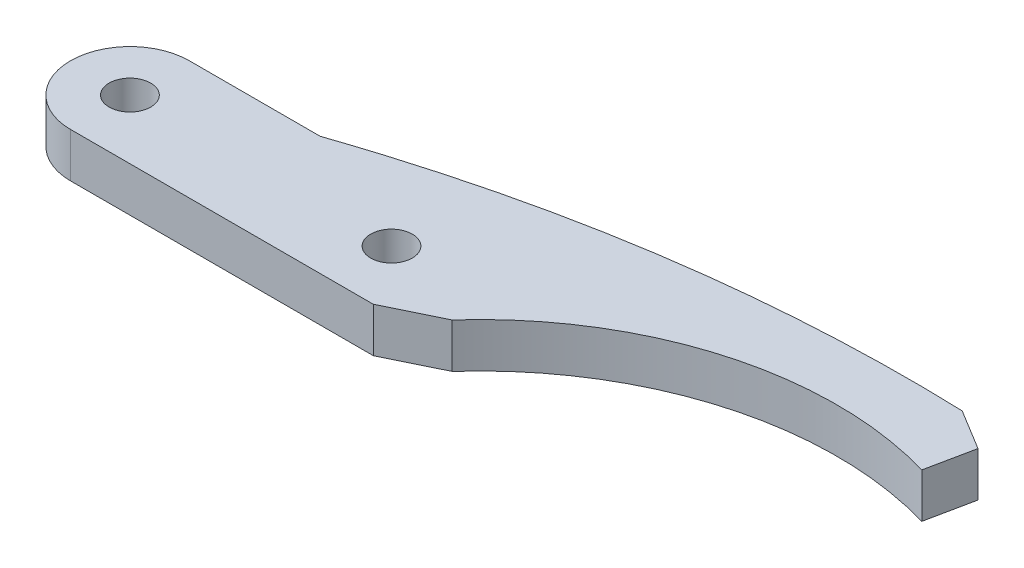
ISO-10303-21;
HEADER;
FILE_DESCRIPTION(('STEP AP214'),'2;1');
FILE_NAME('part.step','',(''),(''),'','','');
FILE_SCHEMA(('AUTOMOTIVE_DESIGN { 1 0 10303 214 1 1 1 1 }'));
ENDSEC;
DATA;
#1=APPLICATION_CONTEXT('core data for automotive mechanical design processes');
#2=APPLICATION_PROTOCOL_DEFINITION('international standard','automotive_design',2000,#1);
#3=PRODUCT_CONTEXT('',#1,'mechanical');
#4=PRODUCT('Part','Part','',(#3));
#5=PRODUCT_RELATED_PRODUCT_CATEGORY('part','',(#4));
#6=PRODUCT_DEFINITION_FORMATION('','',#4);
#7=PRODUCT_DEFINITION_CONTEXT('part definition',#1,'design');
#8=PRODUCT_DEFINITION('design','',#6,#7);
#9=PRODUCT_DEFINITION_SHAPE('','',#8);
#10=(LENGTH_UNIT() NAMED_UNIT(*) SI_UNIT(.MILLI.,.METRE.));
#11=(NAMED_UNIT(*) PLANE_ANGLE_UNIT() SI_UNIT($,.RADIAN.));
#12=(NAMED_UNIT(*) SI_UNIT($,.STERADIAN.) SOLID_ANGLE_UNIT());
#13=UNCERTAINTY_MEASURE_WITH_UNIT(LENGTH_MEASURE(1.E-05),#10,'distance_accuracy_value','');
#14=(GEOMETRIC_REPRESENTATION_CONTEXT(3) GLOBAL_UNCERTAINTY_ASSIGNED_CONTEXT((#13)) GLOBAL_UNIT_ASSIGNED_CONTEXT((#10,
#11,#12)) REPRESENTATION_CONTEXT('',''));
#15=CARTESIAN_POINT('',(0.,0.,0.));
#16=DIRECTION('',(0.,0.,1.));
#17=DIRECTION('',(1.,0.,0.));
#18=AXIS2_PLACEMENT_3D('',#15,#16,#17);
#19=CARTESIAN_POINT('',(0.,10.,0.));
#20=DIRECTION('',(0.,-1.,0.));
#21=DIRECTION('',(0.,0.,-1.));
#22=AXIS2_PLACEMENT_3D('',#19,#20,#21);
#23=CYLINDRICAL_SURFACE('',#22,20.);
#24=CARTESIAN_POINT('',(0.,15.,0.));
#25=DIRECTION('',(0.,1.,0.));
#26=DIRECTION('',(0.,0.,1.));
#27=AXIS2_PLACEMENT_3D('',#24,#25,#26);
#28=CIRCLE('',#27,20.);
#29=CARTESIAN_POINT('',(0.,15.,-20.));
#30=VERTEX_POINT('',#29);
#31=CARTESIAN_POINT('',(0.,15.,20.));
#32=VERTEX_POINT('',#31);
#33=EDGE_CURVE('E181',#30,#32,#28,.T.);
#34=ORIENTED_EDGE('',*,*,#33,.F.);
#35=DIRECTION('',(0.,-1.,0.));
#36=VECTOR('',#35,1.);
#37=CARTESIAN_POINT('',(0.,10.,-20.));
#38=LINE('',#37,#36);
#39=CARTESIAN_POINT('',(0.,0.,-20.));
#40=VERTEX_POINT('',#39);
#41=EDGE_CURVE('E53',#30,#40,#38,.T.);
#42=ORIENTED_EDGE('',*,*,#41,.T.);
#43=CARTESIAN_POINT('',(0.,0.,0.));
#44=DIRECTION('',(0.,1.,0.));
#45=DIRECTION('',(0.,0.,1.));
#46=AXIS2_PLACEMENT_3D('',#43,#44,#45);
#47=CIRCLE('',#46,20.);
#48=CARTESIAN_POINT('',(0.,0.,20.));
#49=VERTEX_POINT('',#48);
#50=EDGE_CURVE('E159',#40,#49,#47,.T.);
#51=ORIENTED_EDGE('',*,*,#50,.T.);
#52=DIRECTION('',(0.,-1.,0.));
#53=VECTOR('',#52,1.);
#54=CARTESIAN_POINT('',(0.,10.,20.));
#55=LINE('',#54,#53);
#56=EDGE_CURVE('E11',#32,#49,#55,.T.);
#57=ORIENTED_EDGE('',*,*,#56,.F.);
#58=EDGE_LOOP('',(#34,#42,#51,#57));
#59=FACE_BOUND('',#58,.T.);
#60=ADVANCED_FACE('F44',(#59),#23,.T.);
#61=CARTESIAN_POINT('',(0.,10.,20.));
#62=DIRECTION('',(0.,0.,1.));
#63=DIRECTION('',(1.,0.,0.));
#64=AXIS2_PLACEMENT_3D('',#61,#62,#63);
#65=PLANE('',#64);
#66=DIRECTION('',(0.,1.,0.));
#67=VECTOR('',#66,1.);
#68=CARTESIAN_POINT('',(101.910822615066,0.,20.));
#69=LINE('',#68,#67);
#70=CARTESIAN_POINT('',(101.910822615066,0.,20.));
#71=VERTEX_POINT('',#70);
#72=CARTESIAN_POINT('',(101.910822615066,15.,20.));
#73=VERTEX_POINT('',#72);
#74=EDGE_CURVE('E147',#71,#73,#69,.T.);
#75=ORIENTED_EDGE('',*,*,#74,.T.);
#76=DIRECTION('',(1.,0.,0.));
#77=VECTOR('',#76,1.);
#78=CARTESIAN_POINT('',(0.,15.,20.));
#79=LINE('',#78,#77);
#80=EDGE_CURVE('E198',#32,#73,#79,.T.);
#81=ORIENTED_EDGE('',*,*,#80,.F.);
#82=ORIENTED_EDGE('',*,*,#56,.T.);
#83=DIRECTION('',(-1.,0.,0.));
#84=VECTOR('',#83,1.);
#85=CARTESIAN_POINT('',(0.,0.,20.));
#86=LINE('',#85,#84);
#87=EDGE_CURVE('E164',#71,#49,#86,.T.);
#88=ORIENTED_EDGE('',*,*,#87,.F.);
#89=EDGE_LOOP('',(#75,#81,#82,#88));
#90=FACE_BOUND('',#89,.T.);
#91=ADVANCED_FACE('F193',(#90),#65,.T.);
#92=CARTESIAN_POINT('',(0.,10.,-20.));
#93=DIRECTION('',(0.,0.,1.));
#94=DIRECTION('',(1.,0.,0.));
#95=AXIS2_PLACEMENT_3D('',#92,#93,#94);
#96=PLANE('',#95);
#97=DIRECTION('',(-1.,0.,-4.42066680035251E-11));
#98=VECTOR('',#97,1.);
#99=CARTESIAN_POINT('',(43.9999999944218,15.,-19.9999999980549));
#100=LINE('',#99,#98);
#101=CARTESIAN_POINT('',(43.999999991625,15.,-19.9999999971214));
#102=VERTEX_POINT('',#101);
#103=EDGE_CURVE('E265',#102,#30,#100,.T.);
#104=ORIENTED_EDGE('',*,*,#103,.F.);
#105=DIRECTION('',(0.,-1.,0.));
#106=VECTOR('',#105,1.);
#107=CARTESIAN_POINT('',(43.9999999972152,20.,-19.9999999990204));
#108=LINE('',#107,#106);
#109=CARTESIAN_POINT('',(44.,10.,-20.));
#110=VERTEX_POINT('',#109);
#111=EDGE_CURVE('E68',#102,#110,#108,.T.);
#112=ORIENTED_EDGE('',*,*,#111,.T.);
#113=DIRECTION('',(0.,1.,0.));
#114=VECTOR('',#113,1.);
#115=CARTESIAN_POINT('',(44.,0.,-20.));
#116=LINE('',#115,#114);
#117=CARTESIAN_POINT('',(44.,0.,-20.));
#118=VERTEX_POINT('',#117);
#119=EDGE_CURVE('E160',#118,#110,#116,.T.);
#120=ORIENTED_EDGE('',*,*,#119,.F.);
#121=DIRECTION('',(-1.,0.,0.));
#122=VECTOR('',#121,1.);
#123=CARTESIAN_POINT('',(0.,0.,-20.));
#124=LINE('',#123,#122);
#125=EDGE_CURVE('E168',#118,#40,#124,.T.);
#126=ORIENTED_EDGE('',*,*,#125,.T.);
#127=ORIENTED_EDGE('',*,*,#41,.F.);
#128=EDGE_LOOP('',(#104,#112,#120,#126,#127));
#129=FACE_BOUND('',#128,.T.);
#130=ADVANCED_FACE('F182',(#129),#96,.F.);
#131=CARTESIAN_POINT('',(0.,10.,0.));
#132=DIRECTION('',(0.,-1.,0.));
#133=DIRECTION('',(0.,0.,-1.));
#134=AXIS2_PLACEMENT_3D('',#131,#132,#133);
#135=CYLINDRICAL_SURFACE('',#134,7.);
#136=CARTESIAN_POINT('',(0.,0.,0.));
#137=DIRECTION('',(0.,1.,0.));
#138=DIRECTION('',(0.,0.,1.));
#139=AXIS2_PLACEMENT_3D('',#136,#137,#138);
#140=CIRCLE('',#139,7.);
#141=CARTESIAN_POINT('',(0.,0.,7.));
#142=VERTEX_POINT('',#141);
#143=EDGE_CURVE('E155',#142,#142,#140,.T.);
#144=ORIENTED_EDGE('',*,*,#143,.F.);
#145=EDGE_LOOP('',(#144));
#146=FACE_BOUND('',#145,.T.);
#147=CARTESIAN_POINT('',(0.,15.,0.));
#148=DIRECTION('',(0.,1.,0.));
#149=DIRECTION('',(0.,0.,1.));
#150=AXIS2_PLACEMENT_3D('',#147,#148,#149);
#151=CIRCLE('',#150,7.);
#152=CARTESIAN_POINT('',(0.,15.,7.));
#153=VERTEX_POINT('',#152);
#154=EDGE_CURVE('E125',#153,#153,#151,.T.);
#155=ORIENTED_EDGE('',*,*,#154,.T.);
#156=EDGE_LOOP('',(#155));
#157=FACE_BOUND('',#156,.T.);
#158=ADVANCED_FACE('F46',(#146,#157),#135,.F.);
#159=CARTESIAN_POINT('',(88.,10.,0.));
#160=DIRECTION('',(0.,-1.,0.));
#161=DIRECTION('',(0.,0.,-1.));
#162=AXIS2_PLACEMENT_3D('',#159,#160,#161);
#163=CYLINDRICAL_SURFACE('',#162,7.);
#164=CARTESIAN_POINT('',(88.,0.,0.));
#165=DIRECTION('',(0.,1.,0.));
#166=DIRECTION('',(0.,0.,1.));
#167=AXIS2_PLACEMENT_3D('',#164,#165,#166);
#168=CIRCLE('',#167,7.);
#169=CARTESIAN_POINT('',(88.,0.,7.));
#170=VERTEX_POINT('',#169);
#171=EDGE_CURVE('E172',#170,#170,#168,.T.);
#172=ORIENTED_EDGE('',*,*,#171,.F.);
#173=EDGE_LOOP('',(#172));
#174=FACE_BOUND('',#173,.T.);
#175=CARTESIAN_POINT('',(88.,15.,0.));
#176=DIRECTION('',(0.,1.,0.));
#177=DIRECTION('',(0.,0.,1.));
#178=AXIS2_PLACEMENT_3D('',#175,#176,#177);
#179=CIRCLE('',#178,7.);
#180=CARTESIAN_POINT('',(88.,15.,7.));
#181=VERTEX_POINT('',#180);
#182=EDGE_CURVE('E281',#181,#181,#179,.T.);
#183=ORIENTED_EDGE('',*,*,#182,.T.);
#184=EDGE_LOOP('',(#183));
#185=FACE_BOUND('',#184,.T.);
#186=ADVANCED_FACE('F286',(#174,#185),#163,.F.);
#187=CARTESIAN_POINT('',(232.,0.,-48.));
#188=DIRECTION('',(0.520684176706967,0.,-0.853749370791562));
#189=DIRECTION('',(-0.853749370791562,0.,-0.520684176706967));
#190=AXIS2_PLACEMENT_3D('',#187,#188,#189);
#191=PLANE('',#190);
#192=DIRECTION('',(0.,-1.,0.));
#193=VECTOR('',#192,1.);
#194=CARTESIAN_POINT('',(232.,20.,-48.));
#195=LINE('',#194,#193);
#196=CARTESIAN_POINT('',(232.,15.,-48.));
#197=VERTEX_POINT('',#196);
#198=CARTESIAN_POINT('',(232.,10.,-48.));
#199=VERTEX_POINT('',#198);
#200=EDGE_CURVE('E202',#197,#199,#195,.T.);
#201=ORIENTED_EDGE('',*,*,#200,.F.);
#202=DIRECTION('',(-0.853749370791562,0.,-0.520684176706967));
#203=VECTOR('',#202,1.);
#204=CARTESIAN_POINT('',(245.659989932665,15.,-39.6690531726885));
#205=LINE('',#204,#203);
#206=CARTESIAN_POINT('',(245.659989932665,15.,-39.6690531726885));
#207=VERTEX_POINT('',#206);
#208=EDGE_CURVE('E60',#207,#197,#205,.T.);
#209=ORIENTED_EDGE('',*,*,#208,.F.);
#210=DIRECTION('',(0.,1.,0.));
#211=VECTOR('',#210,1.);
#212=CARTESIAN_POINT('',(245.659989932665,0.,-39.6690531726885));
#213=LINE('',#212,#211);
#214=CARTESIAN_POINT('',(245.659989932665,0.,-39.6690531726885));
#215=VERTEX_POINT('',#214);
#216=EDGE_CURVE('E133',#215,#207,#213,.T.);
#217=ORIENTED_EDGE('',*,*,#216,.F.);
#218=DIRECTION('',(-0.853749370791562,0.,-0.520684176706967));
#219=VECTOR('',#218,1.);
#220=CARTESIAN_POINT('',(232.,0.,-48.));
#221=LINE('',#220,#219);
#222=CARTESIAN_POINT('',(232.,0.,-48.));
#223=VERTEX_POINT('',#222);
#224=EDGE_CURVE('E233',#215,#223,#221,.T.);
#225=ORIENTED_EDGE('',*,*,#224,.T.);
#226=DIRECTION('',(0.,1.,0.));
#227=VECTOR('',#226,1.);
#228=CARTESIAN_POINT('',(232.,0.,-48.));
#229=LINE('',#228,#227);
#230=EDGE_CURVE('E145',#223,#199,#229,.T.);
#231=ORIENTED_EDGE('',*,*,#230,.T.);
#232=EDGE_LOOP('',(#201,#209,#217,#225,#231));
#233=FACE_BOUND('',#232,.T.);
#234=ADVANCED_FACE('F225',(#233),#191,.T.);
#235=CARTESIAN_POINT('',(245.659989932665,0.,-39.6690531726885));
#236=DIRECTION('',(0.979315823293034,0.,0.202337634284597));
#237=DIRECTION('',(0.202337634284597,0.,-0.979315823293034));
#238=AXIS2_PLACEMENT_3D('',#235,#236,#237);
#239=PLANE('',#238);
#240=ORIENTED_EDGE('',*,*,#216,.T.);
#241=DIRECTION('',(0.202337634284599,0.,-0.979315823293033));
#242=VECTOR('',#241,1.);
#243=CARTESIAN_POINT('',(242.422587784111,15.,-24.));
#244=LINE('',#243,#242);
#245=CARTESIAN_POINT('',(242.422587784111,15.,-24.));
#246=VERTEX_POINT('',#245);
#247=EDGE_CURVE('E118',#246,#207,#244,.T.);
#248=ORIENTED_EDGE('',*,*,#247,.F.);
#249=DIRECTION('',(0.,1.,0.));
#250=VECTOR('',#249,1.);
#251=CARTESIAN_POINT('',(242.422587784111,0.,-24.));
#252=LINE('',#251,#250);
#253=CARTESIAN_POINT('',(242.422587784111,0.,-24.));
#254=VERTEX_POINT('',#253);
#255=EDGE_CURVE('E131',#254,#246,#252,.T.);
#256=ORIENTED_EDGE('',*,*,#255,.F.);
#257=DIRECTION('',(0.202337634284597,0.,-0.979315823293034));
#258=VECTOR('',#257,1.);
#259=CARTESIAN_POINT('',(245.659989932665,0.,-39.6690531726885));
#260=LINE('',#259,#258);
#261=EDGE_CURVE('E261',#254,#215,#260,.T.);
#262=ORIENTED_EDGE('',*,*,#261,.T.);
#263=EDGE_LOOP('',(#240,#248,#256,#262));
#264=FACE_BOUND('',#263,.T.);
#265=ADVANCED_FACE('F129',(#264),#239,.T.);
#266=CARTESIAN_POINT('',(209.184343516904,0.,91.3048963315671));
#267=DIRECTION('',(0.,1.,0.));
#268=DIRECTION('',(0.,0.,1.));
#269=AXIS2_PLACEMENT_3D('',#266,#267,#268);
#270=CYLINDRICAL_SURFACE('',#269,120.);
#271=ORIENTED_EDGE('',*,*,#255,.T.);
#272=CARTESIAN_POINT('',(209.184343516904,15.,91.3048963315671));
#273=DIRECTION('',(0.,-1.,0.));
#274=DIRECTION('',(0.,0.,1.));
#275=AXIS2_PLACEMENT_3D('',#272,#273,#274);
#276=CIRCLE('',#275,120.);
#277=CARTESIAN_POINT('',(119.744098688226,15.,11.3021300982282));
#278=VERTEX_POINT('',#277);
#279=EDGE_CURVE('E115',#278,#246,#276,.T.);
#280=ORIENTED_EDGE('',*,*,#279,.F.);
#281=DIRECTION('',(0.,1.,0.));
#282=VECTOR('',#281,1.);
#283=CARTESIAN_POINT('',(119.744098688226,0.,11.3021300982282));
#284=LINE('',#283,#282);
#285=CARTESIAN_POINT('',(119.744098688226,0.,11.3021300982282));
#286=VERTEX_POINT('',#285);
#287=EDGE_CURVE('E141',#286,#278,#284,.T.);
#288=ORIENTED_EDGE('',*,*,#287,.F.);
#289=CARTESIAN_POINT('',(209.184343516904,0.,91.3048963315671));
#290=DIRECTION('',(0.,-1.,0.));
#291=DIRECTION('',(0.,0.,-1.));
#292=AXIS2_PLACEMENT_3D('',#289,#290,#291);
#293=CIRCLE('',#292,120.);
#294=EDGE_CURVE('E139',#286,#254,#293,.T.);
#295=ORIENTED_EDGE('',*,*,#294,.T.);
#296=EDGE_LOOP('',(#271,#280,#288,#295));
#297=FACE_BOUND('',#296,.T.);
#298=ADVANCED_FACE('F137',(#297),#270,.F.);
#299=CARTESIAN_POINT('',(101.910822615066,0.,20.));
#300=DIRECTION('',(0.438371146789072,0.,0.898794046299169));
#301=DIRECTION('',(0.89879404629917,0.,-0.438371146789072));
#302=AXIS2_PLACEMENT_3D('',#299,#300,#301);
#303=PLANE('',#302);
#304=ORIENTED_EDGE('',*,*,#287,.T.);
#305=DIRECTION('',(0.898794046299169,0.,-0.438371146789072));
#306=VECTOR('',#305,1.);
#307=CARTESIAN_POINT('',(101.910822615066,15.,20.));
#308=LINE('',#307,#306);
#309=EDGE_CURVE('E120',#73,#278,#308,.T.);
#310=ORIENTED_EDGE('',*,*,#309,.F.);
#311=ORIENTED_EDGE('',*,*,#74,.F.);
#312=DIRECTION('',(0.898794046299169,0.,-0.438371146789072));
#313=VECTOR('',#312,1.);
#314=CARTESIAN_POINT('',(101.910822615066,0.,20.));
#315=LINE('',#314,#313);
#316=EDGE_CURVE('E190',#71,#286,#315,.T.);
#317=ORIENTED_EDGE('',*,*,#316,.T.);
#318=EDGE_LOOP('',(#304,#310,#311,#317));
#319=FACE_BOUND('',#318,.T.);
#320=ADVANCED_FACE('F196',(#319),#303,.T.);
#321=CARTESIAN_POINT('',(160659.9924649,20.,987515.853467734));
#322=CARTESIAN_POINT('',(-128401.323984307,20.,-991747.269702922));
#323=CARTESIAN_POINT('',(96729.1826155816,20.,995802.782599833));
#324=B_SPLINE_CURVE_WITH_KNOTS('',2,(#321,#322,#323),.UNSPECIFIED.,.F.,.F.,(3,3),(0.,1.),.UNSPECIFIED.);
#325=DIRECTION('',(0.,-1.,0.));
#326=VECTOR('',#325,1.);
#327=SURFACE_OF_LINEAR_EXTRUSION('',#324,#326);
#328=CARTESIAN_POINT('',(160659.992464903,15.,987515.853467733));
#329=CARTESIAN_POINT('',(-128401.323984308,15.,-991747.269702922));
#330=CARTESIAN_POINT('',(96729.1826155797,15.,995802.782599833));
#331=B_SPLINE_CURVE_WITH_KNOTS('',2,(#328,#329,#330),.UNSPECIFIED.,.F.,.F.,(3,3),(0.,1.),.UNSPECIFIED.);
#332=EDGE_CURVE('E255',#197,#102,#331,.T.);
#333=ORIENTED_EDGE('',*,*,#332,.F.);
#334=ORIENTED_EDGE('',*,*,#200,.T.);
#335=CARTESIAN_POINT('',(232.,10.,-48.));
#336=CARTESIAN_POINT('',(135.765778063889,10.,-51.2362542845225));
#337=CARTESIAN_POINT('',(44.,10.,-20.));
#338=B_SPLINE_CURVE_WITH_KNOTS('',2,(#335,#336,#337),.UNSPECIFIED.,.F.,.F.,(3,3),(0.,1.),.UNSPECIFIED.);
#339=EDGE_CURVE('E235',#199,#110,#338,.T.);
#340=ORIENTED_EDGE('',*,*,#339,.T.);
#341=ORIENTED_EDGE('',*,*,#111,.F.);
#342=EDGE_LOOP('',(#333,#334,#340,#341));
#343=FACE_BOUND('',#342,.T.);
#344=ADVANCED_FACE('F215',(#343),#327,.F.);
#345=CARTESIAN_POINT('',(0.,0.,0.));
#346=DIRECTION('',(0.,1.,0.));
#347=DIRECTION('',(0.,0.,1.));
#348=AXIS2_PLACEMENT_3D('',#345,#346,#347);
#349=PLANE('',#348);
#350=ORIENTED_EDGE('',*,*,#143,.T.);
#351=EDGE_LOOP('',(#350));
#352=FACE_BOUND('',#351,.T.);
#353=ORIENTED_EDGE('',*,*,#50,.F.);
#354=ORIENTED_EDGE('',*,*,#125,.F.);
#355=CARTESIAN_POINT('',(232.,0.,-48.));
#356=CARTESIAN_POINT('',(135.765778063889,0.,-51.2362542845225));
#357=CARTESIAN_POINT('',(44.,0.,-20.));
#358=B_SPLINE_CURVE_WITH_KNOTS('',2,(#355,#356,#357),.UNSPECIFIED.,.F.,.F.,(3,3),(0.,1.),.UNSPECIFIED.);
#359=EDGE_CURVE('E154',#223,#118,#358,.T.);
#360=ORIENTED_EDGE('',*,*,#359,.F.);
#361=ORIENTED_EDGE('',*,*,#224,.F.);
#362=ORIENTED_EDGE('',*,*,#261,.F.);
#363=ORIENTED_EDGE('',*,*,#294,.F.);
#364=ORIENTED_EDGE('',*,*,#316,.F.);
#365=ORIENTED_EDGE('',*,*,#87,.T.);
#366=EDGE_LOOP('',(#353,#354,#360,#361,#362,#363,#364,#365));
#367=FACE_BOUND('',#366,.T.);
#368=ORIENTED_EDGE('',*,*,#171,.T.);
#369=EDGE_LOOP('',(#368));
#370=FACE_BOUND('',#369,.T.);
#371=ADVANCED_FACE('F186',(#352,#367,#370),#349,.F.);
#372=DIRECTION('',(0.,1.,0.));
#373=VECTOR('',#372,1.);
#374=SURFACE_OF_LINEAR_EXTRUSION('',#358,#373);
#375=ORIENTED_EDGE('',*,*,#339,.F.);
#376=ORIENTED_EDGE('',*,*,#230,.F.);
#377=ORIENTED_EDGE('',*,*,#359,.T.);
#378=ORIENTED_EDGE('',*,*,#119,.T.);
#379=EDGE_LOOP('',(#375,#376,#377,#378));
#380=FACE_BOUND('',#379,.T.);
#381=ADVANCED_FACE('F220',(#380),#374,.T.);
#382=CARTESIAN_POINT('',(209.184343516904,15.,91.3048963315671));
#383=DIRECTION('',(0.,1.,0.));
#384=DIRECTION('',(0.,0.,1.));
#385=AXIS2_PLACEMENT_3D('',#382,#383,#384);
#386=PLANE('',#385);
#387=ORIENTED_EDGE('',*,*,#182,.F.);
#388=EDGE_LOOP('',(#387));
#389=FACE_BOUND('',#388,.T.);
#390=ORIENTED_EDGE('',*,*,#154,.F.);
#391=EDGE_LOOP('',(#390));
#392=FACE_BOUND('',#391,.T.);
#393=ORIENTED_EDGE('',*,*,#279,.T.);
#394=ORIENTED_EDGE('',*,*,#247,.T.);
#395=ORIENTED_EDGE('',*,*,#208,.T.);
#396=ORIENTED_EDGE('',*,*,#332,.T.);
#397=ORIENTED_EDGE('',*,*,#103,.T.);
#398=ORIENTED_EDGE('',*,*,#33,.T.);
#399=ORIENTED_EDGE('',*,*,#80,.T.);
#400=ORIENTED_EDGE('',*,*,#309,.T.);
#401=EDGE_LOOP('',(#393,#394,#395,#396,#397,#398,#399,#400));
#402=FACE_BOUND('',#401,.T.);
#403=ADVANCED_FACE('F117',(#389,#392,#402),#386,.T.);
#404=CLOSED_SHELL('',(#60,#91,#130,#158,#186,#234,#265,#298,#320,#344,#371,#381,#403));
#405=MANIFOLD_SOLID_BREP('B2',#404);
#406=ADVANCED_BREP_SHAPE_REPRESENTATION('',(#18,#405),#14);
#407=SHAPE_DEFINITION_REPRESENTATION(#9,#406);
ENDSEC;
END-ISO-10303-21;
